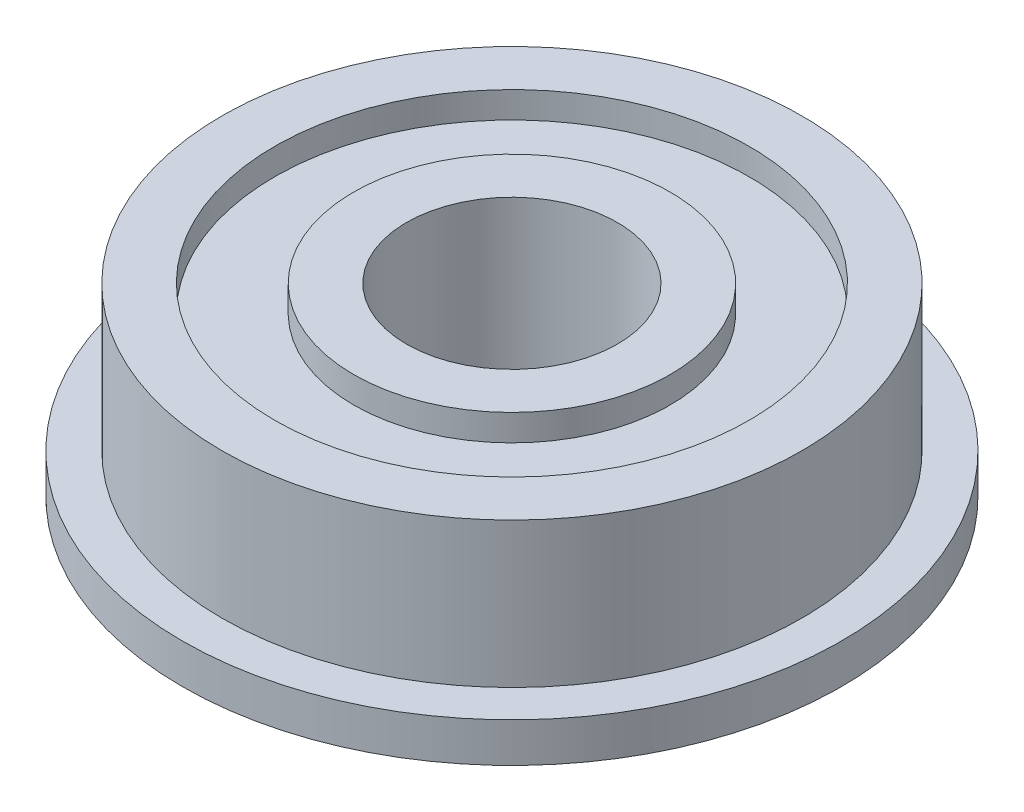
ISO-10303-21;
HEADER;
FILE_DESCRIPTION(('STEP AP214'),'2;1');
FILE_NAME('part.step','',(''),(''),'','','');
FILE_SCHEMA(('AUTOMOTIVE_DESIGN { 1 0 10303 214 1 1 1 1 }'));
ENDSEC;
DATA;
#1=APPLICATION_CONTEXT('core data for automotive mechanical design processes');
#2=APPLICATION_PROTOCOL_DEFINITION('international standard','automotive_design',2000,#1);
#3=PRODUCT_CONTEXT('',#1,'mechanical');
#4=PRODUCT('Part','Part','',(#3));
#5=PRODUCT_RELATED_PRODUCT_CATEGORY('part','',(#4));
#6=PRODUCT_DEFINITION_FORMATION('','',#4);
#7=PRODUCT_DEFINITION_CONTEXT('part definition',#1,'design');
#8=PRODUCT_DEFINITION('design','',#6,#7);
#9=PRODUCT_DEFINITION_SHAPE('','',#8);
#10=(LENGTH_UNIT() NAMED_UNIT(*) SI_UNIT(.MILLI.,.METRE.));
#11=(NAMED_UNIT(*) PLANE_ANGLE_UNIT() SI_UNIT($,.RADIAN.));
#12=(NAMED_UNIT(*) SI_UNIT($,.STERADIAN.) SOLID_ANGLE_UNIT());
#13=UNCERTAINTY_MEASURE_WITH_UNIT(LENGTH_MEASURE(1.E-05),#10,'distance_accuracy_value','');
#14=(GEOMETRIC_REPRESENTATION_CONTEXT(3) GLOBAL_UNCERTAINTY_ASSIGNED_CONTEXT((#13)) GLOBAL_UNIT_ASSIGNED_CONTEXT((#10,
#11,#12)) REPRESENTATION_CONTEXT('',''));
#15=CARTESIAN_POINT('',(0.,0.,0.));
#16=DIRECTION('',(0.,0.,1.));
#17=DIRECTION('',(1.,0.,0.));
#18=AXIS2_PLACEMENT_3D('',#15,#16,#17);
#19=CARTESIAN_POINT('',(0.,0.,0.));
#20=DIRECTION('',(0.,1.,0.));
#21=DIRECTION('',(0.,0.,1.));
#22=AXIS2_PLACEMENT_3D('',#19,#20,#21);
#23=PLANE('',#22);
#24=CARTESIAN_POINT('',(0.,0.,0.));
#25=DIRECTION('',(0.,1.,0.));
#26=DIRECTION('',(0.,0.,1.));
#27=AXIS2_PLACEMENT_3D('',#24,#25,#26);
#28=CIRCLE('',#27,4000.);
#29=CARTESIAN_POINT('',(0.,0.,4000.));
#30=VERTEX_POINT('',#29);
#31=EDGE_CURVE('E37',#30,#30,#28,.T.);
#32=ORIENTED_EDGE('',*,*,#31,.T.);
#33=EDGE_LOOP('',(#32));
#34=FACE_BOUND('',#33,.T.);
#35=CARTESIAN_POINT('',(0.,0.,0.));
#36=DIRECTION('',(0.,-1.,0.));
#37=DIRECTION('',(0.,0.,-1.));
#38=AXIS2_PLACEMENT_3D('',#35,#36,#37);
#39=CIRCLE('',#38,6000.);
#40=CARTESIAN_POINT('',(0.,0.,-6000.));
#41=VERTEX_POINT('',#40);
#42=EDGE_CURVE('E75',#41,#41,#39,.T.);
#43=ORIENTED_EDGE('',*,*,#42,.T.);
#44=EDGE_LOOP('',(#43));
#45=FACE_BOUND('',#44,.T.);
#46=ADVANCED_FACE('F33',(#34,#45),#23,.F.);
#47=CARTESIAN_POINT('',(0.,7000.,0.));
#48=DIRECTION('',(0.,1.,0.));
#49=DIRECTION('',(0.,0.,1.));
#50=AXIS2_PLACEMENT_3D('',#47,#48,#49);
#51=PLANE('',#50);
#52=CARTESIAN_POINT('',(0.,7000.,0.));
#53=DIRECTION('',(0.,1.,0.));
#54=DIRECTION('',(0.,0.,1.));
#55=AXIS2_PLACEMENT_3D('',#52,#53,#54);
#56=CIRCLE('',#55,4000.);
#57=CARTESIAN_POINT('',(0.,7000.,4000.));
#58=VERTEX_POINT('',#57);
#59=EDGE_CURVE('E41',#58,#58,#56,.T.);
#60=ORIENTED_EDGE('',*,*,#59,.F.);
#61=EDGE_LOOP('',(#60));
#62=FACE_BOUND('',#61,.T.);
#63=CARTESIAN_POINT('',(0.,7000.,0.));
#64=DIRECTION('',(0.,1.,0.));
#65=DIRECTION('',(0.,0.,1.));
#66=AXIS2_PLACEMENT_3D('',#63,#64,#65);
#67=CIRCLE('',#66,6000.);
#68=CARTESIAN_POINT('',(0.,7000.,6000.));
#69=VERTEX_POINT('',#68);
#70=EDGE_CURVE('E63',#69,#69,#67,.T.);
#71=ORIENTED_EDGE('',*,*,#70,.T.);
#72=EDGE_LOOP('',(#71));
#73=FACE_BOUND('',#72,.T.);
#74=ADVANCED_FACE('F118',(#62,#73),#51,.T.);
#75=CARTESIAN_POINT('',(0.,7000.,0.));
#76=DIRECTION('',(0.,-1.,0.));
#77=DIRECTION('',(0.,0.,-1.));
#78=AXIS2_PLACEMENT_3D('',#75,#76,#77);
#79=CYLINDRICAL_SURFACE('',#78,4000.);
#80=ORIENTED_EDGE('',*,*,#59,.T.);
#81=EDGE_LOOP('',(#80));
#82=FACE_BOUND('',#81,.T.);
#83=ORIENTED_EDGE('',*,*,#31,.F.);
#84=EDGE_LOOP('',(#83));
#85=FACE_BOUND('',#84,.T.);
#86=ADVANCED_FACE('F35',(#82,#85),#79,.F.);
#87=CARTESIAN_POINT('',(0.,7000.,0.));
#88=DIRECTION('',(0.,-1.,0.));
#89=DIRECTION('',(0.,0.,-1.));
#90=AXIS2_PLACEMENT_3D('',#87,#88,#89);
#91=CYLINDRICAL_SURFACE('',#90,11000.);
#92=CARTESIAN_POINT('',(0.,1500.,0.));
#93=DIRECTION('',(0.,1.,0.));
#94=DIRECTION('',(0.,0.,1.));
#95=AXIS2_PLACEMENT_3D('',#92,#93,#94);
#96=CIRCLE('',#95,11000.);
#97=CARTESIAN_POINT('',(0.,1500.,11000.));
#98=VERTEX_POINT('',#97);
#99=EDGE_CURVE('E50',#98,#98,#96,.T.);
#100=ORIENTED_EDGE('',*,*,#99,.T.);
#101=EDGE_LOOP('',(#100));
#102=FACE_BOUND('',#101,.T.);
#103=CARTESIAN_POINT('',(0.,7000.,0.));
#104=DIRECTION('',(0.,1.,0.));
#105=DIRECTION('',(0.,0.,1.));
#106=AXIS2_PLACEMENT_3D('',#103,#104,#105);
#107=CIRCLE('',#106,11000.);
#108=CARTESIAN_POINT('',(0.,7000.,11000.));
#109=VERTEX_POINT('',#108);
#110=EDGE_CURVE('E10',#109,#109,#107,.T.);
#111=ORIENTED_EDGE('',*,*,#110,.F.);
#112=EDGE_LOOP('',(#111));
#113=FACE_BOUND('',#112,.T.);
#114=ADVANCED_FACE('F126',(#102,#113),#91,.T.);
#115=CARTESIAN_POINT('',(0.,7000.,0.));
#116=DIRECTION('',(0.,1.,0.));
#117=DIRECTION('',(0.,0.,1.));
#118=AXIS2_PLACEMENT_3D('',#115,#116,#117);
#119=CIRCLE('',#118,9000.);
#120=CARTESIAN_POINT('',(0.,7000.,9000.));
#121=VERTEX_POINT('',#120);
#122=EDGE_CURVE('E57',#121,#121,#119,.T.);
#123=ORIENTED_EDGE('',*,*,#122,.F.);
#124=EDGE_LOOP('',(#123));
#125=FACE_BOUND('',#124,.T.);
#126=ORIENTED_EDGE('',*,*,#110,.T.);
#127=EDGE_LOOP('',(#126));
#128=FACE_BOUND('',#127,.T.);
#129=ADVANCED_FACE('F101',(#125,#128),#51,.T.);
#130=CARTESIAN_POINT('',(0.,0.,0.));
#131=DIRECTION('',(0.,-1.,0.));
#132=DIRECTION('',(0.,0.,-1.));
#133=AXIS2_PLACEMENT_3D('',#130,#131,#132);
#134=CIRCLE('',#133,9000.);
#135=CARTESIAN_POINT('',(0.,0.,-9000.));
#136=VERTEX_POINT('',#135);
#137=EDGE_CURVE('E69',#136,#136,#134,.T.);
#138=ORIENTED_EDGE('',*,*,#137,.F.);
#139=EDGE_LOOP('',(#138));
#140=FACE_BOUND('',#139,.T.);
#141=CARTESIAN_POINT('',(0.,0.,0.));
#142=DIRECTION('',(0.,1.,0.));
#143=DIRECTION('',(0.,0.,1.));
#144=AXIS2_PLACEMENT_3D('',#141,#142,#143);
#145=CIRCLE('',#144,12500.);
#146=CARTESIAN_POINT('',(0.,0.,12500.));
#147=VERTEX_POINT('',#146);
#148=EDGE_CURVE('E47',#147,#147,#145,.T.);
#149=ORIENTED_EDGE('',*,*,#148,.F.);
#150=EDGE_LOOP('',(#149));
#151=FACE_BOUND('',#150,.T.);
#152=ADVANCED_FACE('F97',(#140,#151),#23,.F.);
#153=CARTESIAN_POINT('',(0.,1500.,0.));
#154=DIRECTION('',(0.,-1.,0.));
#155=DIRECTION('',(0.,0.,-1.));
#156=AXIS2_PLACEMENT_3D('',#153,#154,#155);
#157=CYLINDRICAL_SURFACE('',#156,12500.);
#158=CARTESIAN_POINT('',(0.,1500.,0.));
#159=DIRECTION('',(0.,1.,0.));
#160=DIRECTION('',(0.,0.,1.));
#161=AXIS2_PLACEMENT_3D('',#158,#159,#160);
#162=CIRCLE('',#161,12500.);
#163=CARTESIAN_POINT('',(0.,1500.,12500.));
#164=VERTEX_POINT('',#163);
#165=EDGE_CURVE('E52',#164,#164,#162,.T.);
#166=ORIENTED_EDGE('',*,*,#165,.F.);
#167=EDGE_LOOP('',(#166));
#168=FACE_BOUND('',#167,.T.);
#169=ORIENTED_EDGE('',*,*,#148,.T.);
#170=EDGE_LOOP('',(#169));
#171=FACE_BOUND('',#170,.T.);
#172=ADVANCED_FACE('F100',(#168,#171),#157,.T.);
#173=CARTESIAN_POINT('',(0.,1500.,0.));
#174=DIRECTION('',(0.,1.,0.));
#175=DIRECTION('',(0.,0.,1.));
#176=AXIS2_PLACEMENT_3D('',#173,#174,#175);
#177=PLANE('',#176);
#178=ORIENTED_EDGE('',*,*,#99,.F.);
#179=EDGE_LOOP('',(#178));
#180=FACE_BOUND('',#179,.T.);
#181=ORIENTED_EDGE('',*,*,#165,.T.);
#182=EDGE_LOOP('',(#181));
#183=FACE_BOUND('',#182,.T.);
#184=ADVANCED_FACE('F106',(#180,#183),#177,.T.);
#185=CARTESIAN_POINT('',(0.,6000.,0.));
#186=DIRECTION('',(0.,1.,0.));
#187=DIRECTION('',(0.,0.,1.));
#188=AXIS2_PLACEMENT_3D('',#185,#186,#187);
#189=CYLINDRICAL_SURFACE('',#188,9000.);
#190=CARTESIAN_POINT('',(0.,6000.,0.));
#191=DIRECTION('',(0.,1.,0.));
#192=DIRECTION('',(0.,0.,1.));
#193=AXIS2_PLACEMENT_3D('',#190,#191,#192);
#194=CIRCLE('',#193,9000.);
#195=CARTESIAN_POINT('',(0.,6000.,9000.));
#196=VERTEX_POINT('',#195);
#197=EDGE_CURVE('E51',#196,#196,#194,.T.);
#198=ORIENTED_EDGE('',*,*,#197,.F.);
#199=EDGE_LOOP('',(#198));
#200=FACE_BOUND('',#199,.T.);
#201=ORIENTED_EDGE('',*,*,#122,.T.);
#202=EDGE_LOOP('',(#201));
#203=FACE_BOUND('',#202,.T.);
#204=ADVANCED_FACE('F112',(#200,#203),#189,.F.);
#205=CARTESIAN_POINT('',(0.,6000.,0.));
#206=DIRECTION('',(0.,1.,0.));
#207=DIRECTION('',(0.,0.,1.));
#208=AXIS2_PLACEMENT_3D('',#205,#206,#207);
#209=PLANE('',#208);
#210=CARTESIAN_POINT('',(0.,6000.,0.));
#211=DIRECTION('',(0.,1.,0.));
#212=DIRECTION('',(0.,0.,1.));
#213=AXIS2_PLACEMENT_3D('',#210,#211,#212);
#214=CIRCLE('',#213,6000.);
#215=CARTESIAN_POINT('',(0.,6000.,6000.));
#216=VERTEX_POINT('',#215);
#217=EDGE_CURVE('E60',#216,#216,#214,.T.);
#218=ORIENTED_EDGE('',*,*,#217,.F.);
#219=EDGE_LOOP('',(#218));
#220=FACE_BOUND('',#219,.T.);
#221=ORIENTED_EDGE('',*,*,#197,.T.);
#222=EDGE_LOOP('',(#221));
#223=FACE_BOUND('',#222,.T.);
#224=ADVANCED_FACE('F147',(#220,#223),#209,.T.);
#225=CARTESIAN_POINT('',(0.,6000.,0.));
#226=DIRECTION('',(0.,1.,0.));
#227=DIRECTION('',(0.,0.,1.));
#228=AXIS2_PLACEMENT_3D('',#225,#226,#227);
#229=CYLINDRICAL_SURFACE('',#228,6000.);
#230=ORIENTED_EDGE('',*,*,#217,.T.);
#231=EDGE_LOOP('',(#230));
#232=FACE_BOUND('',#231,.T.);
#233=ORIENTED_EDGE('',*,*,#70,.F.);
#234=EDGE_LOOP('',(#233));
#235=FACE_BOUND('',#234,.T.);
#236=ADVANCED_FACE('F93',(#232,#235),#229,.T.);
#237=CARTESIAN_POINT('',(0.,1000.,0.));
#238=DIRECTION('',(0.,-1.,0.));
#239=DIRECTION('',(0.,0.,-1.));
#240=AXIS2_PLACEMENT_3D('',#237,#238,#239);
#241=CYLINDRICAL_SURFACE('',#240,9000.);
#242=CARTESIAN_POINT('',(0.,1000.,0.));
#243=DIRECTION('',(0.,-1.,0.));
#244=DIRECTION('',(0.,0.,-1.));
#245=AXIS2_PLACEMENT_3D('',#242,#243,#244);
#246=CIRCLE('',#245,9000.);
#247=CARTESIAN_POINT('',(0.,1000.,-9000.));
#248=VERTEX_POINT('',#247);
#249=EDGE_CURVE('E66',#248,#248,#246,.T.);
#250=ORIENTED_EDGE('',*,*,#249,.F.);
#251=EDGE_LOOP('',(#250));
#252=FACE_BOUND('',#251,.T.);
#253=ORIENTED_EDGE('',*,*,#137,.T.);
#254=EDGE_LOOP('',(#253));
#255=FACE_BOUND('',#254,.T.);
#256=ADVANCED_FACE('F87',(#252,#255),#241,.F.);
#257=CARTESIAN_POINT('',(0.,1000.,0.));
#258=DIRECTION('',(0.,-1.,0.));
#259=DIRECTION('',(0.,0.,-1.));
#260=AXIS2_PLACEMENT_3D('',#257,#258,#259);
#261=PLANE('',#260);
#262=CARTESIAN_POINT('',(0.,1000.,0.));
#263=DIRECTION('',(0.,-1.,0.));
#264=DIRECTION('',(0.,0.,-1.));
#265=AXIS2_PLACEMENT_3D('',#262,#263,#264);
#266=CIRCLE('',#265,6000.);
#267=CARTESIAN_POINT('',(0.,1000.,-6000.));
#268=VERTEX_POINT('',#267);
#269=EDGE_CURVE('E72',#268,#268,#266,.T.);
#270=ORIENTED_EDGE('',*,*,#269,.F.);
#271=EDGE_LOOP('',(#270));
#272=FACE_BOUND('',#271,.T.);
#273=ORIENTED_EDGE('',*,*,#249,.T.);
#274=EDGE_LOOP('',(#273));
#275=FACE_BOUND('',#274,.T.);
#276=ADVANCED_FACE('F84',(#272,#275),#261,.T.);
#277=CARTESIAN_POINT('',(0.,1000.,0.));
#278=DIRECTION('',(0.,-1.,0.));
#279=DIRECTION('',(0.,0.,-1.));
#280=AXIS2_PLACEMENT_3D('',#277,#278,#279);
#281=CYLINDRICAL_SURFACE('',#280,6000.);
#282=ORIENTED_EDGE('',*,*,#269,.T.);
#283=EDGE_LOOP('',(#282));
#284=FACE_BOUND('',#283,.T.);
#285=ORIENTED_EDGE('',*,*,#42,.F.);
#286=EDGE_LOOP('',(#285));
#287=FACE_BOUND('',#286,.T.);
#288=ADVANCED_FACE('F81',(#284,#287),#281,.T.);
#289=CLOSED_SHELL('',(#46,#74,#86,#114,#129,#152,#172,#184,#204,#224,#236,#256,#276,#288));
#290=MANIFOLD_SOLID_BREP('B2',#289);
#291=ADVANCED_BREP_SHAPE_REPRESENTATION('',(#18,#290),#14);
#292=SHAPE_DEFINITION_REPRESENTATION(#9,#291);
ENDSEC;
END-ISO-10303-21;
